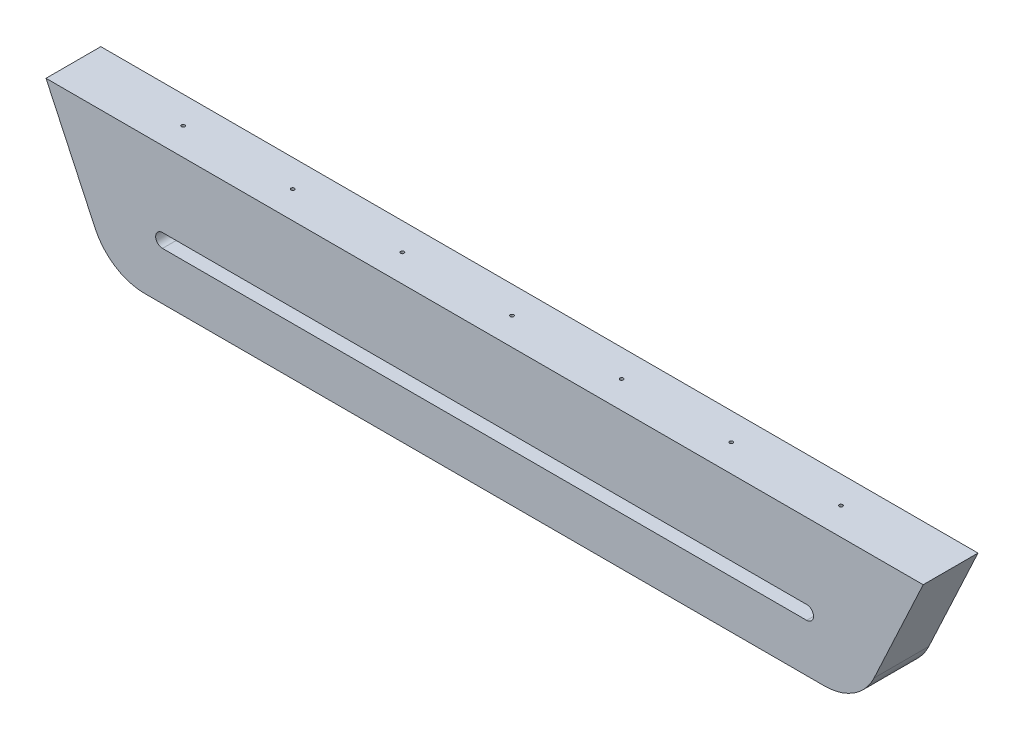
ISO-10303-21;
HEADER;
FILE_DESCRIPTION(('STEP AP214'),'2;1');
FILE_NAME('part.step','',(''),(''),'','','');
FILE_SCHEMA(('AUTOMOTIVE_DESIGN { 1 0 10303 214 1 1 1 1 }'));
ENDSEC;
DATA;
#1=APPLICATION_CONTEXT('core data for automotive mechanical design processes');
#2=APPLICATION_PROTOCOL_DEFINITION('international standard','automotive_design',2000,#1);
#3=PRODUCT_CONTEXT('',#1,'mechanical');
#4=PRODUCT('Part','Part','',(#3));
#5=PRODUCT_RELATED_PRODUCT_CATEGORY('part','',(#4));
#6=PRODUCT_DEFINITION_FORMATION('','',#4);
#7=PRODUCT_DEFINITION_CONTEXT('part definition',#1,'design');
#8=PRODUCT_DEFINITION('design','',#6,#7);
#9=PRODUCT_DEFINITION_SHAPE('','',#8);
#10=(LENGTH_UNIT() NAMED_UNIT(*) SI_UNIT(.MILLI.,.METRE.));
#11=(NAMED_UNIT(*) PLANE_ANGLE_UNIT() SI_UNIT($,.RADIAN.));
#12=(NAMED_UNIT(*) SI_UNIT($,.STERADIAN.) SOLID_ANGLE_UNIT());
#13=UNCERTAINTY_MEASURE_WITH_UNIT(LENGTH_MEASURE(1.E-05),#10,'distance_accuracy_value','');
#14=(GEOMETRIC_REPRESENTATION_CONTEXT(3) GLOBAL_UNCERTAINTY_ASSIGNED_CONTEXT((#13)) GLOBAL_UNIT_ASSIGNED_CONTEXT((#10,
#11,#12)) REPRESENTATION_CONTEXT('',''));
#15=CARTESIAN_POINT('',(0.,0.,0.));
#16=DIRECTION('',(0.,0.,1.));
#17=DIRECTION('',(1.,0.,0.));
#18=AXIS2_PLACEMENT_3D('',#15,#16,#17);
#19=CARTESIAN_POINT('',(-173.589463707157,-63.5,25.4));
#20=DIRECTION('',(0.906307787036648,0.422618261740704,0.));
#21=DIRECTION('',(-0.422618261740704,0.906307787036648,0.));
#22=AXIS2_PLACEMENT_3D('',#19,#20,#21);
#23=PLANE('',#22);
#24=DIRECTION('',(0.422618261740704,-0.906307787036648,0.));
#25=VECTOR('',#24,1.);
#26=CARTESIAN_POINT('',(-173.589463707157,-63.5,0.));
#27=LINE('',#26,#25);
#28=CARTESIAN_POINT('',(-203.2,0.,0.));
#29=VERTEX_POINT('',#28);
#30=CARTESIAN_POINT('',(-180.428096873378,-48.8345038482139,0.));
#31=VERTEX_POINT('',#30);
#32=EDGE_CURVE('E283',#29,#31,#27,.T.);
#33=ORIENTED_EDGE('',*,*,#32,.T.);
#34=DIRECTION('',(0.,0.,-1.));
#35=VECTOR('',#34,1.);
#36=CARTESIAN_POINT('',(-180.428096873378,-48.8345038482139,25.4));
#37=LINE('',#36,#35);
#38=CARTESIAN_POINT('',(-180.428096873378,-48.8345038482139,25.4));
#39=VERTEX_POINT('',#38);
#40=EDGE_CURVE('E318',#31,#39,#37,.F.);
#41=ORIENTED_EDGE('',*,*,#40,.T.);
#42=DIRECTION('',(0.422618261740704,-0.906307787036648,0.));
#43=VECTOR('',#42,1.);
#44=CARTESIAN_POINT('',(-173.589463707157,-63.5,25.4));
#45=LINE('',#44,#43);
#46=CARTESIAN_POINT('',(-203.2,0.,25.4));
#47=VERTEX_POINT('',#46);
#48=EDGE_CURVE('E284',#47,#39,#45,.T.);
#49=ORIENTED_EDGE('',*,*,#48,.F.);
#50=DIRECTION('',(0.,0.,-1.));
#51=VECTOR('',#50,1.);
#52=CARTESIAN_POINT('',(-203.2,0.,25.4));
#53=LINE('',#52,#51);
#54=EDGE_CURVE('E295',#47,#29,#53,.T.);
#55=ORIENTED_EDGE('',*,*,#54,.T.);
#56=EDGE_LOOP('',(#33,#41,#49,#55));
#57=FACE_BOUND('',#56,.T.);
#58=ADVANCED_FACE('F109',(#57),#23,.F.);
#59=CARTESIAN_POINT('',(173.589463707157,-63.5,25.4));
#60=DIRECTION('',(0.,1.,0.));
#61=DIRECTION('',(0.,0.,1.));
#62=AXIS2_PLACEMENT_3D('',#59,#60,#61);
#63=PLANE('',#62);
#64=DIRECTION('',(1.,0.,0.));
#65=VECTOR('',#64,1.);
#66=CARTESIAN_POINT('',(173.589463707157,-63.5,25.4));
#67=LINE('',#66,#65);
#68=CARTESIAN_POINT('',(-157.407879082647,-63.5,25.4));
#69=VERTEX_POINT('',#68);
#70=CARTESIAN_POINT('',(157.407879082647,-63.5,25.4));
#71=VERTEX_POINT('',#70);
#72=EDGE_CURVE('E287',#69,#71,#67,.T.);
#73=ORIENTED_EDGE('',*,*,#72,.F.);
#74=DIRECTION('',(0.,0.,-1.));
#75=VECTOR('',#74,1.);
#76=CARTESIAN_POINT('',(-157.407879082647,-63.5,25.4));
#77=LINE('',#76,#75);
#78=CARTESIAN_POINT('',(-157.407879082647,-63.5,0.));
#79=VERTEX_POINT('',#78);
#80=EDGE_CURVE('E311',#69,#79,#77,.T.);
#81=ORIENTED_EDGE('',*,*,#80,.T.);
#82=DIRECTION('',(1.,0.,0.));
#83=VECTOR('',#82,1.);
#84=CARTESIAN_POINT('',(173.589463707157,-63.5,0.));
#85=LINE('',#84,#83);
#86=CARTESIAN_POINT('',(157.407879082647,-63.5,0.));
#87=VERTEX_POINT('',#86);
#88=EDGE_CURVE('E298',#79,#87,#85,.T.);
#89=ORIENTED_EDGE('',*,*,#88,.T.);
#90=DIRECTION('',(0.,0.,-1.));
#91=VECTOR('',#90,1.);
#92=CARTESIAN_POINT('',(157.407879082647,-63.5,25.4));
#93=LINE('',#92,#91);
#94=EDGE_CURVE('E309',#87,#71,#93,.F.);
#95=ORIENTED_EDGE('',*,*,#94,.T.);
#96=EDGE_LOOP('',(#73,#81,#89,#95));
#97=FACE_BOUND('',#96,.T.);
#98=ADVANCED_FACE('F331',(#97),#63,.F.);
#99=CARTESIAN_POINT('',(203.2,0.,25.4));
#100=DIRECTION('',(-0.906307787036648,0.422618261740704,0.));
#101=DIRECTION('',(-0.422618261740704,-0.906307787036648,0.));
#102=AXIS2_PLACEMENT_3D('',#99,#100,#101);
#103=PLANE('',#102);
#104=DIRECTION('',(0.422618261740704,0.906307787036648,0.));
#105=VECTOR('',#104,1.);
#106=CARTESIAN_POINT('',(203.2,0.,25.4));
#107=LINE('',#106,#105);
#108=CARTESIAN_POINT('',(180.428096873378,-48.8345038482139,25.4));
#109=VERTEX_POINT('',#108);
#110=CARTESIAN_POINT('',(203.2,0.,25.4));
#111=VERTEX_POINT('',#110);
#112=EDGE_CURVE('E291',#109,#111,#107,.T.);
#113=ORIENTED_EDGE('',*,*,#112,.F.);
#114=DIRECTION('',(0.,0.,-1.));
#115=VECTOR('',#114,1.);
#116=CARTESIAN_POINT('',(180.428096873378,-48.8345038482139,25.4));
#117=LINE('',#116,#115);
#118=CARTESIAN_POINT('',(180.428096873378,-48.8345038482139,0.));
#119=VERTEX_POINT('',#118);
#120=EDGE_CURVE('E13',#109,#119,#117,.T.);
#121=ORIENTED_EDGE('',*,*,#120,.T.);
#122=DIRECTION('',(0.422618261740704,0.906307787036648,0.));
#123=VECTOR('',#122,1.);
#124=CARTESIAN_POINT('',(203.2,0.,0.));
#125=LINE('',#124,#123);
#126=CARTESIAN_POINT('',(203.2,0.,0.));
#127=VERTEX_POINT('',#126);
#128=EDGE_CURVE('E301',#119,#127,#125,.T.);
#129=ORIENTED_EDGE('',*,*,#128,.T.);
#130=DIRECTION('',(0.,0.,-1.));
#131=VECTOR('',#130,1.);
#132=CARTESIAN_POINT('',(203.2,0.,25.4));
#133=LINE('',#132,#131);
#134=EDGE_CURVE('E306',#111,#127,#133,.T.);
#135=ORIENTED_EDGE('',*,*,#134,.F.);
#136=EDGE_LOOP('',(#113,#121,#129,#135));
#137=FACE_BOUND('',#136,.T.);
#138=ADVANCED_FACE('F348',(#137),#103,.F.);
#139=CARTESIAN_POINT('',(-203.2,0.,25.4));
#140=DIRECTION('',(0.,-1.,0.));
#141=DIRECTION('',(0.,0.,-1.));
#142=AXIS2_PLACEMENT_3D('',#139,#140,#141);
#143=PLANE('',#142);
#144=CARTESIAN_POINT('',(-152.4,0.,12.7));
#145=DIRECTION('',(0.,1.,0.));
#146=DIRECTION('',(0.,0.,1.));
#147=AXIS2_PLACEMENT_3D('',#144,#145,#146);
#148=CIRCLE('',#147,0.793749999999982);
#149=CARTESIAN_POINT('',(-152.4,0.,13.49375));
#150=VERTEX_POINT('',#149);
#151=EDGE_CURVE('E216',#150,#150,#148,.T.);
#152=ORIENTED_EDGE('',*,*,#151,.F.);
#153=EDGE_LOOP('',(#152));
#154=FACE_BOUND('',#153,.T.);
#155=CARTESIAN_POINT('',(-101.6,0.,12.7));
#156=DIRECTION('',(0.,1.,0.));
#157=DIRECTION('',(0.,0.,1.));
#158=AXIS2_PLACEMENT_3D('',#155,#156,#157);
#159=CIRCLE('',#158,0.793749999999996);
#160=CARTESIAN_POINT('',(-101.6,0.,13.49375));
#161=VERTEX_POINT('',#160);
#162=EDGE_CURVE('E215',#161,#161,#159,.T.);
#163=ORIENTED_EDGE('',*,*,#162,.F.);
#164=EDGE_LOOP('',(#163));
#165=FACE_BOUND('',#164,.T.);
#166=CARTESIAN_POINT('',(-50.8,0.,12.7));
#167=DIRECTION('',(0.,1.,0.));
#168=DIRECTION('',(0.,0.,1.));
#169=AXIS2_PLACEMENT_3D('',#166,#167,#168);
#170=CIRCLE('',#169,0.793749999999996);
#171=CARTESIAN_POINT('',(-50.8,0.,13.49375));
#172=VERTEX_POINT('',#171);
#173=EDGE_CURVE('E226',#172,#172,#170,.T.);
#174=ORIENTED_EDGE('',*,*,#173,.F.);
#175=EDGE_LOOP('',(#174));
#176=FACE_BOUND('',#175,.T.);
#177=CARTESIAN_POINT('',(0.,0.,12.7));
#178=DIRECTION('',(0.,1.,0.));
#179=DIRECTION('',(0.,0.,1.));
#180=AXIS2_PLACEMENT_3D('',#177,#178,#179);
#181=CIRCLE('',#180,0.793749999999994);
#182=CARTESIAN_POINT('',(0.,0.,13.49375));
#183=VERTEX_POINT('',#182);
#184=EDGE_CURVE('E232',#183,#183,#181,.T.);
#185=ORIENTED_EDGE('',*,*,#184,.F.);
#186=EDGE_LOOP('',(#185));
#187=FACE_BOUND('',#186,.T.);
#188=CARTESIAN_POINT('',(50.8,0.,12.7));
#189=DIRECTION('',(0.,1.,0.));
#190=DIRECTION('',(0.,0.,1.));
#191=AXIS2_PLACEMENT_3D('',#188,#189,#190);
#192=CIRCLE('',#191,0.793749999999996);
#193=CARTESIAN_POINT('',(50.8,0.,13.49375));
#194=VERTEX_POINT('',#193);
#195=EDGE_CURVE('E238',#194,#194,#192,.T.);
#196=ORIENTED_EDGE('',*,*,#195,.F.);
#197=EDGE_LOOP('',(#196));
#198=FACE_BOUND('',#197,.T.);
#199=CARTESIAN_POINT('',(101.6,0.,12.7));
#200=DIRECTION('',(0.,1.,0.));
#201=DIRECTION('',(0.,0.,1.));
#202=AXIS2_PLACEMENT_3D('',#199,#200,#201);
#203=CIRCLE('',#202,0.793749999999996);
#204=CARTESIAN_POINT('',(101.6,0.,13.49375));
#205=VERTEX_POINT('',#204);
#206=EDGE_CURVE('E244',#205,#205,#203,.T.);
#207=ORIENTED_EDGE('',*,*,#206,.F.);
#208=EDGE_LOOP('',(#207));
#209=FACE_BOUND('',#208,.T.);
#210=CARTESIAN_POINT('',(152.4,0.,12.7));
#211=DIRECTION('',(0.,1.,0.));
#212=DIRECTION('',(0.,0.,1.));
#213=AXIS2_PLACEMENT_3D('',#210,#211,#212);
#214=CIRCLE('',#213,0.793749999999982);
#215=CARTESIAN_POINT('',(152.4,0.,13.49375));
#216=VERTEX_POINT('',#215);
#217=EDGE_CURVE('E250',#216,#216,#214,.T.);
#218=ORIENTED_EDGE('',*,*,#217,.F.);
#219=EDGE_LOOP('',(#218));
#220=FACE_BOUND('',#219,.T.);
#221=DIRECTION('',(-1.,0.,0.));
#222=VECTOR('',#221,1.);
#223=CARTESIAN_POINT('',(-203.2,0.,0.));
#224=LINE('',#223,#222);
#225=EDGE_CURVE('E288',#127,#29,#224,.T.);
#226=ORIENTED_EDGE('',*,*,#225,.T.);
#227=ORIENTED_EDGE('',*,*,#54,.F.);
#228=DIRECTION('',(-1.,0.,0.));
#229=VECTOR('',#228,1.);
#230=CARTESIAN_POINT('',(-203.2,0.,25.4));
#231=LINE('',#230,#229);
#232=EDGE_CURVE('E293',#111,#47,#231,.T.);
#233=ORIENTED_EDGE('',*,*,#232,.F.);
#234=ORIENTED_EDGE('',*,*,#134,.T.);
#235=EDGE_LOOP('',(#226,#227,#233,#234));
#236=FACE_BOUND('',#235,.T.);
#237=ADVANCED_FACE('F343',(#154,#165,#176,#187,#198,#209,#220,#236),#143,.F.);
#238=CARTESIAN_POINT('',(0.,0.,25.4));
#239=DIRECTION('',(0.,0.,-1.));
#240=DIRECTION('',(-1.,0.,0.));
#241=AXIS2_PLACEMENT_3D('',#238,#239,#240);
#242=PLANE('',#241);
#243=CARTESIAN_POINT('',(149.225,-38.1,25.4));
#244=DIRECTION('',(0.,0.,1.));
#245=DIRECTION('',(1.,0.,0.));
#246=AXIS2_PLACEMENT_3D('',#243,#244,#245);
#247=CIRCLE('',#246,3.17499999999999);
#248=CARTESIAN_POINT('',(149.225,-41.275,25.4));
#249=VERTEX_POINT('',#248);
#250=CARTESIAN_POINT('',(149.225,-34.925,25.4));
#251=VERTEX_POINT('',#250);
#252=EDGE_CURVE('E272',#249,#251,#247,.T.);
#253=ORIENTED_EDGE('',*,*,#252,.F.);
#254=DIRECTION('',(1.,0.,0.));
#255=VECTOR('',#254,1.);
#256=CARTESIAN_POINT('',(-149.225,-41.2750000000001,25.4));
#257=LINE('',#256,#255);
#258=CARTESIAN_POINT('',(-149.225,-41.275,25.4));
#259=VERTEX_POINT('',#258);
#260=EDGE_CURVE('E256',#259,#249,#257,.T.);
#261=ORIENTED_EDGE('',*,*,#260,.F.);
#262=CARTESIAN_POINT('',(-149.225,-38.1000000000001,25.4));
#263=DIRECTION('',(0.,0.,1.));
#264=DIRECTION('',(1.,0.,0.));
#265=AXIS2_PLACEMENT_3D('',#262,#263,#264);
#266=CIRCLE('',#265,3.17499999999999);
#267=CARTESIAN_POINT('',(-149.225,-34.9250000000001,25.4));
#268=VERTEX_POINT('',#267);
#269=EDGE_CURVE('E266',#268,#259,#266,.T.);
#270=ORIENTED_EDGE('',*,*,#269,.F.);
#271=DIRECTION('',(1.,0.,0.));
#272=VECTOR('',#271,1.);
#273=CARTESIAN_POINT('',(-149.225,-34.9250000000001,25.4));
#274=LINE('',#273,#272);
#275=EDGE_CURVE('E263',#268,#251,#274,.T.);
#276=ORIENTED_EDGE('',*,*,#275,.T.);
#277=EDGE_LOOP('',(#253,#261,#270,#276));
#278=FACE_BOUND('',#277,.T.);
#279=ORIENTED_EDGE('',*,*,#48,.T.);
#280=CARTESIAN_POINT('',(-157.407879082647,-38.1,25.4));
#281=DIRECTION('',(0.,0.,-1.));
#282=DIRECTION('',(-1.,0.,0.));
#283=AXIS2_PLACEMENT_3D('',#280,#281,#282);
#284=CIRCLE('',#283,25.4);
#285=EDGE_CURVE('E117',#39,#69,#284,.F.);
#286=ORIENTED_EDGE('',*,*,#285,.T.);
#287=ORIENTED_EDGE('',*,*,#72,.T.);
#288=CARTESIAN_POINT('',(157.407879082647,-38.1,25.4));
#289=DIRECTION('',(0.,0.,-1.));
#290=DIRECTION('',(-1.,0.,0.));
#291=AXIS2_PLACEMENT_3D('',#288,#289,#290);
#292=CIRCLE('',#291,25.4);
#293=EDGE_CURVE('E320',#71,#109,#292,.F.);
#294=ORIENTED_EDGE('',*,*,#293,.T.);
#295=ORIENTED_EDGE('',*,*,#112,.T.);
#296=ORIENTED_EDGE('',*,*,#232,.T.);
#297=EDGE_LOOP('',(#279,#286,#287,#294,#295,#296));
#298=FACE_BOUND('',#297,.T.);
#299=ADVANCED_FACE('F324',(#278,#298),#242,.F.);
#300=CARTESIAN_POINT('',(0.,0.,0.));
#301=DIRECTION('',(0.,0.,-1.));
#302=DIRECTION('',(-1.,0.,0.));
#303=AXIS2_PLACEMENT_3D('',#300,#301,#302);
#304=PLANE('',#303);
#305=CARTESIAN_POINT('',(149.225,-38.1,0.));
#306=DIRECTION('',(0.,0.,1.));
#307=DIRECTION('',(1.,0.,0.));
#308=AXIS2_PLACEMENT_3D('',#305,#306,#307);
#309=CIRCLE('',#308,3.17499999999999);
#310=CARTESIAN_POINT('',(149.225,-41.275,0.));
#311=VERTEX_POINT('',#310);
#312=CARTESIAN_POINT('',(149.225,-34.925,0.));
#313=VERTEX_POINT('',#312);
#314=EDGE_CURVE('E275',#311,#313,#309,.T.);
#315=ORIENTED_EDGE('',*,*,#314,.T.);
#316=DIRECTION('',(1.,0.,0.));
#317=VECTOR('',#316,1.);
#318=CARTESIAN_POINT('',(-149.225,-34.9250000000001,0.));
#319=LINE('',#318,#317);
#320=CARTESIAN_POINT('',(-149.225,-34.9250000000001,0.));
#321=VERTEX_POINT('',#320);
#322=EDGE_CURVE('E261',#321,#313,#319,.T.);
#323=ORIENTED_EDGE('',*,*,#322,.F.);
#324=CARTESIAN_POINT('',(-149.225,-38.1000000000001,0.));
#325=DIRECTION('',(0.,0.,1.));
#326=DIRECTION('',(1.,0.,0.));
#327=AXIS2_PLACEMENT_3D('',#324,#325,#326);
#328=CIRCLE('',#327,3.17499999999999);
#329=CARTESIAN_POINT('',(-149.225,-41.275,0.));
#330=VERTEX_POINT('',#329);
#331=EDGE_CURVE('E124',#321,#330,#328,.T.);
#332=ORIENTED_EDGE('',*,*,#331,.T.);
#333=DIRECTION('',(1.,0.,0.));
#334=VECTOR('',#333,1.);
#335=CARTESIAN_POINT('',(-149.225,-41.275,0.));
#336=LINE('',#335,#334);
#337=EDGE_CURVE('E258',#330,#311,#336,.T.);
#338=ORIENTED_EDGE('',*,*,#337,.T.);
#339=EDGE_LOOP('',(#315,#323,#332,#338));
#340=FACE_BOUND('',#339,.T.);
#341=ORIENTED_EDGE('',*,*,#88,.F.);
#342=CARTESIAN_POINT('',(-157.407879082647,-38.1,0.));
#343=DIRECTION('',(0.,0.,-1.));
#344=DIRECTION('',(-1.,0.,0.));
#345=AXIS2_PLACEMENT_3D('',#342,#343,#344);
#346=CIRCLE('',#345,25.4);
#347=EDGE_CURVE('E316',#79,#31,#346,.T.);
#348=ORIENTED_EDGE('',*,*,#347,.T.);
#349=ORIENTED_EDGE('',*,*,#32,.F.);
#350=ORIENTED_EDGE('',*,*,#225,.F.);
#351=ORIENTED_EDGE('',*,*,#128,.F.);
#352=CARTESIAN_POINT('',(157.407879082647,-38.1,0.));
#353=DIRECTION('',(0.,0.,-1.));
#354=DIRECTION('',(-1.,0.,0.));
#355=AXIS2_PLACEMENT_3D('',#352,#353,#354);
#356=CIRCLE('',#355,25.4);
#357=EDGE_CURVE('E314',#119,#87,#356,.T.);
#358=ORIENTED_EDGE('',*,*,#357,.T.);
#359=EDGE_LOOP('',(#341,#348,#349,#350,#351,#358));
#360=FACE_BOUND('',#359,.T.);
#361=ADVANCED_FACE('F337',(#340,#360),#304,.T.);
#362=CARTESIAN_POINT('',(-157.407879082647,-38.1,25.4));
#363=DIRECTION('',(0.,0.,-1.));
#364=DIRECTION('',(-1.,0.,0.));
#365=AXIS2_PLACEMENT_3D('',#362,#363,#364);
#366=CYLINDRICAL_SURFACE('',#365,25.4);
#367=ORIENTED_EDGE('',*,*,#285,.F.);
#368=ORIENTED_EDGE('',*,*,#40,.F.);
#369=ORIENTED_EDGE('',*,*,#347,.F.);
#370=ORIENTED_EDGE('',*,*,#80,.F.);
#371=EDGE_LOOP('',(#367,#368,#369,#370));
#372=FACE_BOUND('',#371,.T.);
#373=ADVANCED_FACE('F334',(#372),#366,.T.);
#374=CARTESIAN_POINT('',(157.407879082647,-38.1,25.4));
#375=DIRECTION('',(0.,0.,-1.));
#376=DIRECTION('',(-1.,0.,0.));
#377=AXIS2_PLACEMENT_3D('',#374,#375,#376);
#378=CYLINDRICAL_SURFACE('',#377,25.4);
#379=ORIENTED_EDGE('',*,*,#293,.F.);
#380=ORIENTED_EDGE('',*,*,#94,.F.);
#381=ORIENTED_EDGE('',*,*,#357,.F.);
#382=ORIENTED_EDGE('',*,*,#120,.F.);
#383=EDGE_LOOP('',(#379,#380,#381,#382));
#384=FACE_BOUND('',#383,.T.);
#385=ADVANCED_FACE('F111',(#384),#378,.T.);
#386=CARTESIAN_POINT('',(149.225,-38.1,25.4));
#387=DIRECTION('',(0.,0.,1.));
#388=DIRECTION('',(1.,0.,0.));
#389=AXIS2_PLACEMENT_3D('',#386,#387,#388);
#390=CYLINDRICAL_SURFACE('',#389,3.17499999999999);
#391=ORIENTED_EDGE('',*,*,#314,.F.);
#392=DIRECTION('',(0.,0.,1.));
#393=VECTOR('',#392,1.);
#394=CARTESIAN_POINT('',(149.225,-41.275,25.4));
#395=LINE('',#394,#393);
#396=EDGE_CURVE('E280',#249,#311,#395,.F.);
#397=ORIENTED_EDGE('',*,*,#396,.F.);
#398=ORIENTED_EDGE('',*,*,#252,.T.);
#399=DIRECTION('',(0.,0.,1.));
#400=VECTOR('',#399,1.);
#401=CARTESIAN_POINT('',(149.225,-34.925,25.4));
#402=LINE('',#401,#400);
#403=EDGE_CURVE('E278',#313,#251,#402,.T.);
#404=ORIENTED_EDGE('',*,*,#403,.F.);
#405=EDGE_LOOP('',(#391,#397,#398,#404));
#406=FACE_BOUND('',#405,.T.);
#407=ADVANCED_FACE('F352',(#406),#390,.F.);
#408=CARTESIAN_POINT('',(-149.225,-38.1000000000001,25.4));
#409=DIRECTION('',(0.,0.,1.));
#410=DIRECTION('',(1.,0.,0.));
#411=AXIS2_PLACEMENT_3D('',#408,#409,#410);
#412=CYLINDRICAL_SURFACE('',#411,3.17499999999999);
#413=ORIENTED_EDGE('',*,*,#269,.T.);
#414=DIRECTION('',(0.,0.,1.));
#415=VECTOR('',#414,1.);
#416=CARTESIAN_POINT('',(-149.225,-41.275,25.4));
#417=LINE('',#416,#415);
#418=EDGE_CURVE('E269',#330,#259,#417,.T.);
#419=ORIENTED_EDGE('',*,*,#418,.F.);
#420=ORIENTED_EDGE('',*,*,#331,.F.);
#421=DIRECTION('',(0.,0.,1.));
#422=VECTOR('',#421,1.);
#423=CARTESIAN_POINT('',(-149.225,-34.9250000000001,25.4));
#424=LINE('',#423,#422);
#425=EDGE_CURVE('E128',#268,#321,#424,.F.);
#426=ORIENTED_EDGE('',*,*,#425,.F.);
#427=EDGE_LOOP('',(#413,#419,#420,#426));
#428=FACE_BOUND('',#427,.T.);
#429=ADVANCED_FACE('F357',(#428),#412,.F.);
#430=CARTESIAN_POINT('',(-149.225,-34.9250000000001,25.4));
#431=DIRECTION('',(0.,1.,0.));
#432=DIRECTION('',(-1.,0.,0.));
#433=AXIS2_PLACEMENT_3D('',#430,#431,#432);
#434=PLANE('',#433);
#435=ORIENTED_EDGE('',*,*,#403,.T.);
#436=ORIENTED_EDGE('',*,*,#275,.F.);
#437=ORIENTED_EDGE('',*,*,#425,.T.);
#438=ORIENTED_EDGE('',*,*,#322,.T.);
#439=EDGE_LOOP('',(#435,#436,#437,#438));
#440=FACE_BOUND('',#439,.T.);
#441=ADVANCED_FACE('F380',(#440),#434,.F.);
#442=CARTESIAN_POINT('',(-149.225,-41.275,25.4));
#443=DIRECTION('',(0.,-1.,0.));
#444=DIRECTION('',(1.,0.,0.));
#445=AXIS2_PLACEMENT_3D('',#442,#443,#444);
#446=PLANE('',#445);
#447=ORIENTED_EDGE('',*,*,#396,.T.);
#448=ORIENTED_EDGE('',*,*,#337,.F.);
#449=ORIENTED_EDGE('',*,*,#418,.T.);
#450=ORIENTED_EDGE('',*,*,#260,.T.);
#451=EDGE_LOOP('',(#447,#448,#449,#450));
#452=FACE_BOUND('',#451,.T.);
#453=ADVANCED_FACE('F383',(#452),#446,.F.);
#454=CARTESIAN_POINT('',(152.4,-12.7,12.7));
#455=DIRECTION('',(0.,1.,0.));
#456=DIRECTION('',(0.,0.,1.));
#457=AXIS2_PLACEMENT_3D('',#454,#455,#456);
#458=CONICAL_SURFACE('',#457,0.793749999999982,1.02974425867665);
#459=CARTESIAN_POINT('',(152.4,-13.1769331163531,12.7));
#460=VERTEX_POINT('',#459);
#461=VERTEX_LOOP('',#460);
#462=FACE_BOUND('',#461,.T.);
#463=CARTESIAN_POINT('',(152.4,-12.7,12.7));
#464=DIRECTION('',(0.,1.,0.));
#465=DIRECTION('',(0.,0.,1.));
#466=AXIS2_PLACEMENT_3D('',#463,#464,#465);
#467=CIRCLE('',#466,0.793749999999982);
#468=CARTESIAN_POINT('',(152.4,-12.7,13.49375));
#469=VERTEX_POINT('',#468);
#470=EDGE_CURVE('E253',#469,#469,#467,.T.);
#471=ORIENTED_EDGE('',*,*,#470,.T.);
#472=EDGE_LOOP('',(#471));
#473=FACE_BOUND('',#472,.T.);
#474=ADVANCED_FACE('F387',(#462,#473),#458,.F.);
#475=CARTESIAN_POINT('',(152.4,0.,12.7));
#476=DIRECTION('',(0.,1.,0.));
#477=DIRECTION('',(0.,0.,1.));
#478=AXIS2_PLACEMENT_3D('',#475,#476,#477);
#479=CYLINDRICAL_SURFACE('',#478,0.793749999999982);
#480=ORIENTED_EDGE('',*,*,#470,.F.);
#481=EDGE_LOOP('',(#480));
#482=FACE_BOUND('',#481,.T.);
#483=ORIENTED_EDGE('',*,*,#217,.T.);
#484=EDGE_LOOP('',(#483));
#485=FACE_BOUND('',#484,.T.);
#486=ADVANCED_FACE('F391',(#482,#485),#479,.F.);
#487=CARTESIAN_POINT('',(101.6,-12.7,12.7));
#488=DIRECTION('',(0.,1.,0.));
#489=DIRECTION('',(0.,0.,1.));
#490=AXIS2_PLACEMENT_3D('',#487,#488,#489);
#491=CONICAL_SURFACE('',#490,0.793749999999996,1.02974425867666);
#492=CARTESIAN_POINT('',(101.6,-13.1769331163531,12.7));
#493=VERTEX_POINT('',#492);
#494=VERTEX_LOOP('',#493);
#495=FACE_BOUND('',#494,.T.);
#496=CARTESIAN_POINT('',(101.6,-12.7,12.7));
#497=DIRECTION('',(0.,1.,0.));
#498=DIRECTION('',(0.,0.,1.));
#499=AXIS2_PLACEMENT_3D('',#496,#497,#498);
#500=CIRCLE('',#499,0.793749999999996);
#501=CARTESIAN_POINT('',(101.6,-12.7,13.49375));
#502=VERTEX_POINT('',#501);
#503=EDGE_CURVE('E247',#502,#502,#500,.T.);
#504=ORIENTED_EDGE('',*,*,#503,.T.);
#505=EDGE_LOOP('',(#504));
#506=FACE_BOUND('',#505,.T.);
#507=ADVANCED_FACE('F395',(#495,#506),#491,.F.);
#508=CARTESIAN_POINT('',(101.6,0.,12.7));
#509=DIRECTION('',(0.,1.,0.));
#510=DIRECTION('',(0.,0.,1.));
#511=AXIS2_PLACEMENT_3D('',#508,#509,#510);
#512=CYLINDRICAL_SURFACE('',#511,0.793749999999996);
#513=ORIENTED_EDGE('',*,*,#503,.F.);
#514=EDGE_LOOP('',(#513));
#515=FACE_BOUND('',#514,.T.);
#516=ORIENTED_EDGE('',*,*,#206,.T.);
#517=EDGE_LOOP('',(#516));
#518=FACE_BOUND('',#517,.T.);
#519=ADVANCED_FACE('F399',(#515,#518),#512,.F.);
#520=CARTESIAN_POINT('',(50.8,-12.7,12.7));
#521=DIRECTION('',(0.,1.,0.));
#522=DIRECTION('',(0.,0.,1.));
#523=AXIS2_PLACEMENT_3D('',#520,#521,#522);
#524=CONICAL_SURFACE('',#523,0.793749999999989,1.02974425867665);
#525=CARTESIAN_POINT('',(50.8,-13.1769331163531,12.7));
#526=VERTEX_POINT('',#525);
#527=VERTEX_LOOP('',#526);
#528=FACE_BOUND('',#527,.T.);
#529=CARTESIAN_POINT('',(50.8,-12.7,12.7));
#530=DIRECTION('',(0.,1.,0.));
#531=DIRECTION('',(0.,0.,1.));
#532=AXIS2_PLACEMENT_3D('',#529,#530,#531);
#533=CIRCLE('',#532,0.793749999999989);
#534=CARTESIAN_POINT('',(50.8,-12.7,13.49375));
#535=VERTEX_POINT('',#534);
#536=EDGE_CURVE('E241',#535,#535,#533,.T.);
#537=ORIENTED_EDGE('',*,*,#536,.T.);
#538=EDGE_LOOP('',(#537));
#539=FACE_BOUND('',#538,.T.);
#540=ADVANCED_FACE('F403',(#528,#539),#524,.F.);
#541=CARTESIAN_POINT('',(50.8,0.,12.7));
#542=DIRECTION('',(0.,1.,0.));
#543=DIRECTION('',(0.,0.,1.));
#544=AXIS2_PLACEMENT_3D('',#541,#542,#543);
#545=CYLINDRICAL_SURFACE('',#544,0.793749999999992);
#546=ORIENTED_EDGE('',*,*,#536,.F.);
#547=EDGE_LOOP('',(#546));
#548=FACE_BOUND('',#547,.T.);
#549=ORIENTED_EDGE('',*,*,#195,.T.);
#550=EDGE_LOOP('',(#549));
#551=FACE_BOUND('',#550,.T.);
#552=ADVANCED_FACE('F407',(#548,#551),#545,.F.);
#553=CARTESIAN_POINT('',(0.,-12.7,12.7));
#554=DIRECTION('',(0.,1.,0.));
#555=DIRECTION('',(0.,0.,1.));
#556=AXIS2_PLACEMENT_3D('',#553,#554,#555);
#557=CONICAL_SURFACE('',#556,0.793749999999992,1.02974425867665);
#558=CARTESIAN_POINT('',(0.,-13.1769331163531,12.7));
#559=VERTEX_POINT('',#558);
#560=VERTEX_LOOP('',#559);
#561=FACE_BOUND('',#560,.T.);
#562=CARTESIAN_POINT('',(0.,-12.7,12.7));
#563=DIRECTION('',(0.,1.,0.));
#564=DIRECTION('',(0.,0.,1.));
#565=AXIS2_PLACEMENT_3D('',#562,#563,#564);
#566=CIRCLE('',#565,0.793749999999992);
#567=CARTESIAN_POINT('',(0.,-12.7,13.49375));
#568=VERTEX_POINT('',#567);
#569=EDGE_CURVE('E235',#568,#568,#566,.T.);
#570=ORIENTED_EDGE('',*,*,#569,.T.);
#571=EDGE_LOOP('',(#570));
#572=FACE_BOUND('',#571,.T.);
#573=ADVANCED_FACE('F411',(#561,#572),#557,.F.);
#574=CARTESIAN_POINT('',(0.,0.,12.7));
#575=DIRECTION('',(0.,1.,0.));
#576=DIRECTION('',(0.,0.,1.));
#577=AXIS2_PLACEMENT_3D('',#574,#575,#576);
#578=CYLINDRICAL_SURFACE('',#577,0.793749999999993);
#579=ORIENTED_EDGE('',*,*,#569,.F.);
#580=EDGE_LOOP('',(#579));
#581=FACE_BOUND('',#580,.T.);
#582=ORIENTED_EDGE('',*,*,#184,.T.);
#583=EDGE_LOOP('',(#582));
#584=FACE_BOUND('',#583,.T.);
#585=ADVANCED_FACE('F415',(#581,#584),#578,.F.);
#586=CARTESIAN_POINT('',(-50.8,-12.7,12.7));
#587=DIRECTION('',(0.,1.,0.));
#588=DIRECTION('',(0.,0.,1.));
#589=AXIS2_PLACEMENT_3D('',#586,#587,#588);
#590=CONICAL_SURFACE('',#589,0.793749999999989,1.02974425867665);
#591=CARTESIAN_POINT('',(-50.8,-13.1769331163531,12.7));
#592=VERTEX_POINT('',#591);
#593=VERTEX_LOOP('',#592);
#594=FACE_BOUND('',#593,.T.);
#595=CARTESIAN_POINT('',(-50.8,-12.7,12.7));
#596=DIRECTION('',(0.,1.,0.));
#597=DIRECTION('',(0.,0.,1.));
#598=AXIS2_PLACEMENT_3D('',#595,#596,#597);
#599=CIRCLE('',#598,0.793749999999989);
#600=CARTESIAN_POINT('',(-50.8,-12.7,13.49375));
#601=VERTEX_POINT('',#600);
#602=EDGE_CURVE('E229',#601,#601,#599,.T.);
#603=ORIENTED_EDGE('',*,*,#602,.T.);
#604=EDGE_LOOP('',(#603));
#605=FACE_BOUND('',#604,.T.);
#606=ADVANCED_FACE('F419',(#594,#605),#590,.F.);
#607=CARTESIAN_POINT('',(-50.8,0.,12.7));
#608=DIRECTION('',(0.,1.,0.));
#609=DIRECTION('',(0.,0.,1.));
#610=AXIS2_PLACEMENT_3D('',#607,#608,#609);
#611=CYLINDRICAL_SURFACE('',#610,0.793749999999992);
#612=ORIENTED_EDGE('',*,*,#602,.F.);
#613=EDGE_LOOP('',(#612));
#614=FACE_BOUND('',#613,.T.);
#615=ORIENTED_EDGE('',*,*,#173,.T.);
#616=EDGE_LOOP('',(#615));
#617=FACE_BOUND('',#616,.T.);
#618=ADVANCED_FACE('F423',(#614,#617),#611,.F.);
#619=CARTESIAN_POINT('',(-101.6,-12.7,12.7));
#620=DIRECTION('',(0.,1.,0.));
#621=DIRECTION('',(0.,0.,1.));
#622=AXIS2_PLACEMENT_3D('',#619,#620,#621);
#623=CONICAL_SURFACE('',#622,0.793749999999996,1.02974425867666);
#624=CARTESIAN_POINT('',(-101.6,-13.1769331163531,12.7));
#625=VERTEX_POINT('',#624);
#626=VERTEX_LOOP('',#625);
#627=FACE_BOUND('',#626,.T.);
#628=CARTESIAN_POINT('',(-101.6,-12.7,12.7));
#629=DIRECTION('',(0.,1.,0.));
#630=DIRECTION('',(0.,0.,1.));
#631=AXIS2_PLACEMENT_3D('',#628,#629,#630);
#632=CIRCLE('',#631,0.793749999999996);
#633=CARTESIAN_POINT('',(-101.6,-12.7,13.49375));
#634=VERTEX_POINT('',#633);
#635=EDGE_CURVE('E219',#634,#634,#632,.T.);
#636=ORIENTED_EDGE('',*,*,#635,.T.);
#637=EDGE_LOOP('',(#636));
#638=FACE_BOUND('',#637,.T.);
#639=ADVANCED_FACE('F427',(#627,#638),#623,.F.);
#640=CARTESIAN_POINT('',(-101.6,0.,12.7));
#641=DIRECTION('',(0.,1.,0.));
#642=DIRECTION('',(0.,0.,1.));
#643=AXIS2_PLACEMENT_3D('',#640,#641,#642);
#644=CYLINDRICAL_SURFACE('',#643,0.793749999999996);
#645=ORIENTED_EDGE('',*,*,#635,.F.);
#646=EDGE_LOOP('',(#645));
#647=FACE_BOUND('',#646,.T.);
#648=ORIENTED_EDGE('',*,*,#162,.T.);
#649=EDGE_LOOP('',(#648));
#650=FACE_BOUND('',#649,.T.);
#651=ADVANCED_FACE('F209',(#647,#650),#644,.F.);
#652=CARTESIAN_POINT('',(-152.4,-12.7,12.7));
#653=DIRECTION('',(0.,1.,0.));
#654=DIRECTION('',(0.,0.,1.));
#655=AXIS2_PLACEMENT_3D('',#652,#653,#654);
#656=CONICAL_SURFACE('',#655,0.793749999999982,1.02974425867665);
#657=CARTESIAN_POINT('',(-152.4,-13.1769331163532,12.7));
#658=VERTEX_POINT('',#657);
#659=VERTEX_LOOP('',#658);
#660=FACE_BOUND('',#659,.T.);
#661=CARTESIAN_POINT('',(-152.4,-12.7,12.7));
#662=DIRECTION('',(0.,1.,0.));
#663=DIRECTION('',(0.,0.,1.));
#664=AXIS2_PLACEMENT_3D('',#661,#662,#663);
#665=CIRCLE('',#664,0.793749999999982);
#666=CARTESIAN_POINT('',(-152.4,-12.7,13.49375));
#667=VERTEX_POINT('',#666);
#668=EDGE_CURVE('E213',#667,#667,#665,.T.);
#669=ORIENTED_EDGE('',*,*,#668,.T.);
#670=EDGE_LOOP('',(#669));
#671=FACE_BOUND('',#670,.T.);
#672=ADVANCED_FACE('F205',(#660,#671),#656,.F.);
#673=CARTESIAN_POINT('',(-152.4,0.,12.7));
#674=DIRECTION('',(0.,1.,0.));
#675=DIRECTION('',(0.,0.,1.));
#676=AXIS2_PLACEMENT_3D('',#673,#674,#675);
#677=CYLINDRICAL_SURFACE('',#676,0.793749999999982);
#678=ORIENTED_EDGE('',*,*,#668,.F.);
#679=EDGE_LOOP('',(#678));
#680=FACE_BOUND('',#679,.T.);
#681=ORIENTED_EDGE('',*,*,#151,.T.);
#682=EDGE_LOOP('',(#681));
#683=FACE_BOUND('',#682,.T.);
#684=ADVANCED_FACE('F208',(#680,#683),#677,.F.);
#685=CLOSED_SHELL('',(#58,#98,#138,#237,#299,#361,#373,#385,#407,#429,#441,#453,#474,#486,#507,
#519,#540,#552,#573,#585,#606,#618,#639,#651,#672,#684));
#686=MANIFOLD_SOLID_BREP('B2',#685);
#687=ADVANCED_BREP_SHAPE_REPRESENTATION('',(#18,#686),#14);
#688=SHAPE_DEFINITION_REPRESENTATION(#9,#687);
ENDSEC;
END-ISO-10303-21;
